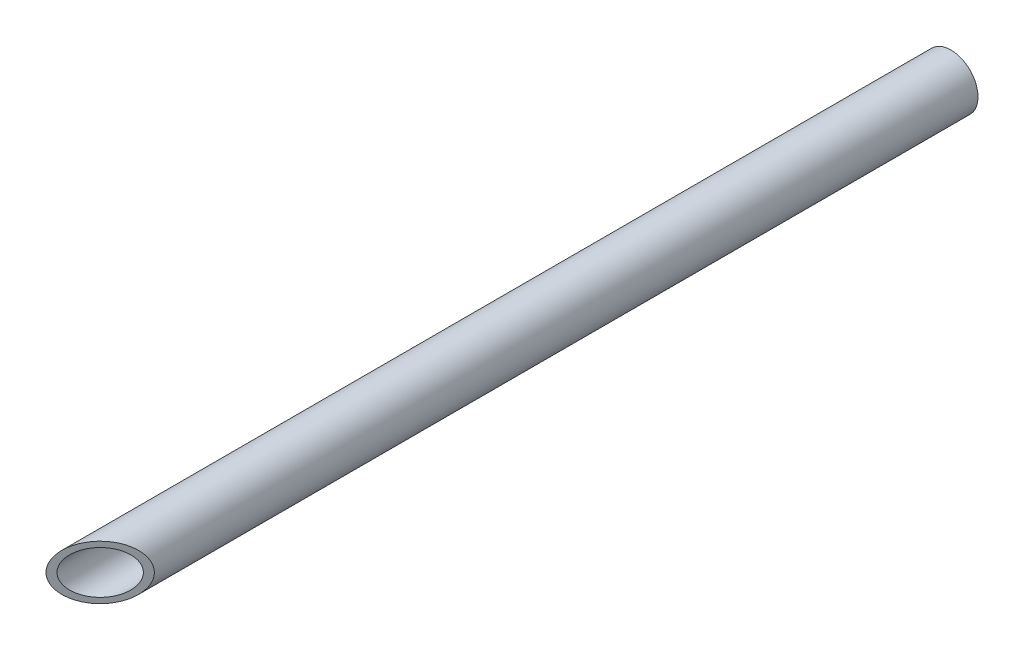
ISO-10303-21;
HEADER;
FILE_DESCRIPTION(('STEP AP214'),'2;1');
FILE_NAME('part.step','',(''),(''),'','','');
FILE_SCHEMA(('AUTOMOTIVE_DESIGN { 1 0 10303 214 1 1 1 1 }'));
ENDSEC;
DATA;
#1=APPLICATION_CONTEXT('core data for automotive mechanical design processes');
#2=APPLICATION_PROTOCOL_DEFINITION('international standard','automotive_design',2000,#1);
#3=PRODUCT_CONTEXT('',#1,'mechanical');
#4=PRODUCT('Part','Part','',(#3));
#5=PRODUCT_RELATED_PRODUCT_CATEGORY('part','',(#4));
#6=PRODUCT_DEFINITION_FORMATION('','',#4);
#7=PRODUCT_DEFINITION_CONTEXT('part definition',#1,'design');
#8=PRODUCT_DEFINITION('design','',#6,#7);
#9=PRODUCT_DEFINITION_SHAPE('','',#8);
#10=(LENGTH_UNIT() NAMED_UNIT(*) SI_UNIT(.MILLI.,.METRE.));
#11=(NAMED_UNIT(*) PLANE_ANGLE_UNIT() SI_UNIT($,.RADIAN.));
#12=(NAMED_UNIT(*) SI_UNIT($,.STERADIAN.) SOLID_ANGLE_UNIT());
#13=UNCERTAINTY_MEASURE_WITH_UNIT(LENGTH_MEASURE(1.E-05),#10,'distance_accuracy_value','');
#14=(GEOMETRIC_REPRESENTATION_CONTEXT(3) GLOBAL_UNCERTAINTY_ASSIGNED_CONTEXT((#13)) GLOBAL_UNIT_ASSIGNED_CONTEXT((#10,
#11,#12)) REPRESENTATION_CONTEXT('',''));
#15=CARTESIAN_POINT('',(0.,0.,0.));
#16=DIRECTION('',(0.,0.,1.));
#17=DIRECTION('',(1.,0.,0.));
#18=AXIS2_PLACEMENT_3D('',#15,#16,#17);
#19=CARTESIAN_POINT('',(262.35025005,0.,262.350250049991));
#20=DIRECTION('',(-0.70710678118656,0.,-0.707106781186535));
#21=DIRECTION('',(-0.707106781186535,0.,0.70710678118656));
#22=AXIS2_PLACEMENT_3D('',#19,#20,#21);
#23=PLANE('',#22);
#24=CARTESIAN_POINT('',(0.,0.,524.7005001));
#25=DIRECTION('',(-0.70710678118656,0.,-0.707106781186536));
#26=DIRECTION('',(-0.707106781186536,0.,0.70710678118656));
#27=AXIS2_PLACEMENT_3D('',#24,#25,#26);
#28=ELLIPSE('',#27,23.6180735984123,16.7005);
#29=CARTESIAN_POINT('',(-16.7005,0.,541.4010001));
#30=VERTEX_POINT('',#29);
#31=EDGE_CURVE('E22',#30,#30,#28,.T.);
#32=ORIENTED_EDGE('',*,*,#31,.F.);
#33=EDGE_LOOP('',(#32));
#34=FACE_BOUND('',#33,.T.);
#35=CARTESIAN_POINT('',(0.,0.,524.7005001));
#36=DIRECTION('',(0.70710678118656,0.,0.707106781186536));
#37=DIRECTION('',(-0.707106781186536,0.,0.70710678118656));
#38=AXIS2_PLACEMENT_3D('',#35,#36,#37);
#39=ELLIPSE('',#38,18.8405773420034,13.3223);
#40=CARTESIAN_POINT('',(-13.3223,0.,538.0228001));
#41=VERTEX_POINT('',#40);
#42=EDGE_CURVE('E9',#41,#41,#39,.T.);
#43=ORIENTED_EDGE('',*,*,#42,.F.);
#44=EDGE_LOOP('',(#43));
#45=FACE_BOUND('',#44,.T.);
#46=ADVANCED_FACE('F14',(#34,#45),#23,.F.);
#47=CARTESIAN_POINT('',(0.,0.,0.));
#48=DIRECTION('',(0.,0.,1.));
#49=DIRECTION('',(1.,0.,0.));
#50=AXIS2_PLACEMENT_3D('',#47,#48,#49);
#51=CYLINDRICAL_SURFACE('',#50,13.3223);
#52=ORIENTED_EDGE('',*,*,#42,.T.);
#53=EDGE_LOOP('',(#52));
#54=FACE_BOUND('',#53,.T.);
#55=CARTESIAN_POINT('',(0.,0.,0.));
#56=DIRECTION('',(0.,0.,1.));
#57=DIRECTION('',(1.,0.,0.));
#58=AXIS2_PLACEMENT_3D('',#55,#56,#57);
#59=CIRCLE('',#58,13.3223);
#60=CARTESIAN_POINT('',(13.3223,0.,0.));
#61=VERTEX_POINT('',#60);
#62=EDGE_CURVE('E28',#61,#61,#59,.T.);
#63=ORIENTED_EDGE('',*,*,#62,.F.);
#64=EDGE_LOOP('',(#63));
#65=FACE_BOUND('',#64,.T.);
#66=ADVANCED_FACE('F16',(#54,#65),#51,.F.);
#67=CARTESIAN_POINT('',(0.,0.,0.));
#68=DIRECTION('',(0.,0.,1.));
#69=DIRECTION('',(1.,0.,0.));
#70=AXIS2_PLACEMENT_3D('',#67,#68,#69);
#71=CYLINDRICAL_SURFACE('',#70,16.7005);
#72=ORIENTED_EDGE('',*,*,#31,.T.);
#73=EDGE_LOOP('',(#72));
#74=FACE_BOUND('',#73,.T.);
#75=CARTESIAN_POINT('',(0.,0.,0.));
#76=DIRECTION('',(0.,0.,-1.));
#77=DIRECTION('',(0.,-1.,0.));
#78=AXIS2_PLACEMENT_3D('',#75,#76,#77);
#79=CIRCLE('',#78,16.7005);
#80=CARTESIAN_POINT('',(0.,-16.7005,0.));
#81=VERTEX_POINT('',#80);
#82=EDGE_CURVE('E18',#81,#81,#79,.T.);
#83=ORIENTED_EDGE('',*,*,#82,.F.);
#84=EDGE_LOOP('',(#83));
#85=FACE_BOUND('',#84,.T.);
#86=ADVANCED_FACE('F37',(#74,#85),#71,.T.);
#87=CARTESIAN_POINT('',(0.,0.,0.));
#88=DIRECTION('',(0.,0.,1.));
#89=DIRECTION('',(1.,0.,0.));
#90=AXIS2_PLACEMENT_3D('',#87,#88,#89);
#91=PLANE('',#90);
#92=ORIENTED_EDGE('',*,*,#82,.T.);
#93=EDGE_LOOP('',(#92));
#94=FACE_BOUND('',#93,.T.);
#95=ORIENTED_EDGE('',*,*,#62,.T.);
#96=EDGE_LOOP('',(#95));
#97=FACE_BOUND('',#96,.T.);
#98=ADVANCED_FACE('F35',(#94,#97),#91,.F.);
#99=CLOSED_SHELL('',(#46,#66,#86,#98));
#100=MANIFOLD_SOLID_BREP('B1',#99);
#101=ADVANCED_BREP_SHAPE_REPRESENTATION('',(#18,#100),#14);
#102=SHAPE_DEFINITION_REPRESENTATION(#9,#101);
ENDSEC;
END-ISO-10303-21;
